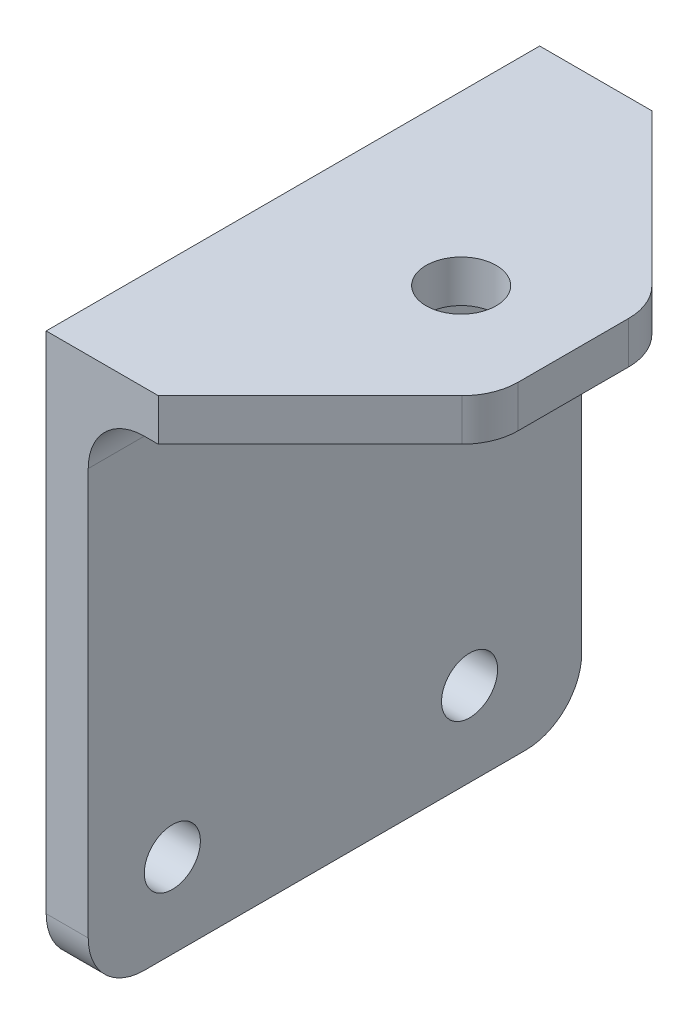
ISO-10303-21;
HEADER;
FILE_DESCRIPTION(('STEP AP214'),'2;1');
FILE_NAME('part.step','',(''),(''),'','','');
FILE_SCHEMA(('AUTOMOTIVE_DESIGN { 1 0 10303 214 1 1 1 1 }'));
ENDSEC;
DATA;
#1=APPLICATION_CONTEXT('core data for automotive mechanical design processes');
#2=APPLICATION_PROTOCOL_DEFINITION('international standard','automotive_design',2000,#1);
#3=PRODUCT_CONTEXT('',#1,'mechanical');
#4=PRODUCT('Part','Part','',(#3));
#5=PRODUCT_RELATED_PRODUCT_CATEGORY('part','',(#4));
#6=PRODUCT_DEFINITION_FORMATION('','',#4);
#7=PRODUCT_DEFINITION_CONTEXT('part definition',#1,'design');
#8=PRODUCT_DEFINITION('design','',#6,#7);
#9=PRODUCT_DEFINITION_SHAPE('','',#8);
#10=(LENGTH_UNIT() NAMED_UNIT(*) SI_UNIT(.MILLI.,.METRE.));
#11=(NAMED_UNIT(*) PLANE_ANGLE_UNIT() SI_UNIT($,.RADIAN.));
#12=(NAMED_UNIT(*) SI_UNIT($,.STERADIAN.) SOLID_ANGLE_UNIT());
#13=UNCERTAINTY_MEASURE_WITH_UNIT(LENGTH_MEASURE(1.E-05),#10,'distance_accuracy_value','');
#14=(GEOMETRIC_REPRESENTATION_CONTEXT(3) GLOBAL_UNCERTAINTY_ASSIGNED_CONTEXT((#13)) GLOBAL_UNIT_ASSIGNED_CONTEXT((#10,
#11,#12)) REPRESENTATION_CONTEXT('',''));
#15=CARTESIAN_POINT('',(0.,0.,0.));
#16=DIRECTION('',(0.,0.,1.));
#17=DIRECTION('',(1.,0.,0.));
#18=AXIS2_PLACEMENT_3D('',#15,#16,#17);
#19=CARTESIAN_POINT('',(0.,-63.5,55.88));
#20=DIRECTION('',(0.,1.,0.));
#21=DIRECTION('',(0.,0.,1.));
#22=AXIS2_PLACEMENT_3D('',#19,#20,#21);
#23=PLANE('',#22);
#24=DIRECTION('',(0.,0.,-1.));
#25=VECTOR('',#24,1.);
#26=CARTESIAN_POINT('',(0.,-63.5,55.88));
#27=LINE('',#26,#25);
#28=CARTESIAN_POINT('',(0.,-63.5,49.53));
#29=VERTEX_POINT('',#28);
#30=CARTESIAN_POINT('',(0.,-63.5,6.35));
#31=VERTEX_POINT('',#30);
#32=EDGE_CURVE('E164',#29,#31,#27,.T.);
#33=ORIENTED_EDGE('',*,*,#32,.T.);
#34=DIRECTION('',(1.,0.,0.));
#35=VECTOR('',#34,1.);
#36=CARTESIAN_POINT('',(4.7625,-63.5,6.35));
#37=LINE('',#36,#35);
#38=CARTESIAN_POINT('',(4.7625,-63.5,6.35));
#39=VERTEX_POINT('',#38);
#40=EDGE_CURVE('E213',#31,#39,#37,.T.);
#41=ORIENTED_EDGE('',*,*,#40,.T.);
#42=DIRECTION('',(0.,0.,-1.));
#43=VECTOR('',#42,1.);
#44=CARTESIAN_POINT('',(4.7625,-63.5,55.88));
#45=LINE('',#44,#43);
#46=CARTESIAN_POINT('',(4.7625,-63.5,49.53));
#47=VERTEX_POINT('',#46);
#48=EDGE_CURVE('E181',#47,#39,#45,.T.);
#49=ORIENTED_EDGE('',*,*,#48,.F.);
#50=DIRECTION('',(1.,0.,0.));
#51=VECTOR('',#50,1.);
#52=CARTESIAN_POINT('',(0.,-63.5,49.53));
#53=LINE('',#52,#51);
#54=EDGE_CURVE('E211',#47,#29,#53,.F.);
#55=ORIENTED_EDGE('',*,*,#54,.T.);
#56=EDGE_LOOP('',(#33,#41,#49,#55));
#57=FACE_BOUND('',#56,.T.);
#58=ADVANCED_FACE('F33',(#57),#23,.F.);
#59=CARTESIAN_POINT('',(4.7625,-63.5,55.88));
#60=DIRECTION('',(-1.,0.,0.));
#61=DIRECTION('',(0.,0.,1.));
#62=AXIS2_PLACEMENT_3D('',#59,#60,#61);
#63=PLANE('',#62);
#64=CARTESIAN_POINT('',(4.7625,-53.975,12.7));
#65=DIRECTION('',(1.,0.,0.));
#66=DIRECTION('',(0.,0.,-1.));
#67=AXIS2_PLACEMENT_3D('',#64,#65,#66);
#68=CIRCLE('',#67,3.175);
#69=CARTESIAN_POINT('',(4.7625,-53.975,9.525));
#70=VERTEX_POINT('',#69);
#71=EDGE_CURVE('E192',#70,#70,#68,.T.);
#72=ORIENTED_EDGE('',*,*,#71,.F.);
#73=EDGE_LOOP('',(#72));
#74=FACE_BOUND('',#73,.T.);
#75=CARTESIAN_POINT('',(4.7625,-53.975,46.355));
#76=DIRECTION('',(1.,0.,0.));
#77=DIRECTION('',(0.,0.,-1.));
#78=AXIS2_PLACEMENT_3D('',#75,#76,#77);
#79=CIRCLE('',#78,3.175);
#80=CARTESIAN_POINT('',(4.7625,-53.975,43.18));
#81=VERTEX_POINT('',#80);
#82=EDGE_CURVE('E188',#81,#81,#79,.T.);
#83=ORIENTED_EDGE('',*,*,#82,.F.);
#84=EDGE_LOOP('',(#83));
#85=FACE_BOUND('',#84,.T.);
#86=ORIENTED_EDGE('',*,*,#48,.T.);
#87=CARTESIAN_POINT('',(4.7625,-57.15,6.35));
#88=DIRECTION('',(-1.,0.,0.));
#89=DIRECTION('',(0.,0.,1.));
#90=AXIS2_PLACEMENT_3D('',#87,#88,#89);
#91=CIRCLE('',#90,6.35);
#92=CARTESIAN_POINT('',(4.7625,-57.15,0.));
#93=VERTEX_POINT('',#92);
#94=EDGE_CURVE('E218',#39,#93,#91,.F.);
#95=ORIENTED_EDGE('',*,*,#94,.T.);
#96=DIRECTION('',(0.,1.,0.));
#97=VECTOR('',#96,1.);
#98=CARTESIAN_POINT('',(4.7625,-63.5,0.));
#99=LINE('',#98,#97);
#100=CARTESIAN_POINT('',(4.7625,-11.1125,0.));
#101=VERTEX_POINT('',#100);
#102=EDGE_CURVE('E232',#93,#101,#99,.T.);
#103=ORIENTED_EDGE('',*,*,#102,.T.);
#104=DIRECTION('',(0.,0.,-1.));
#105=VECTOR('',#104,1.);
#106=CARTESIAN_POINT('',(4.7625,-11.1125,55.88));
#107=LINE('',#106,#105);
#108=CARTESIAN_POINT('',(4.7625,-11.1125,55.88));
#109=VERTEX_POINT('',#108);
#110=EDGE_CURVE('E178',#109,#101,#107,.T.);
#111=ORIENTED_EDGE('',*,*,#110,.F.);
#112=DIRECTION('',(0.,1.,0.));
#113=VECTOR('',#112,1.);
#114=CARTESIAN_POINT('',(4.7625,-63.5,55.88));
#115=LINE('',#114,#113);
#116=CARTESIAN_POINT('',(4.7625,-57.15,55.88));
#117=VERTEX_POINT('',#116);
#118=EDGE_CURVE('E158',#117,#109,#115,.T.);
#119=ORIENTED_EDGE('',*,*,#118,.F.);
#120=CARTESIAN_POINT('',(4.7625,-57.15,49.53));
#121=DIRECTION('',(-1.,0.,0.));
#122=DIRECTION('',(0.,0.,1.));
#123=AXIS2_PLACEMENT_3D('',#120,#121,#122);
#124=CIRCLE('',#123,6.35);
#125=EDGE_CURVE('E216',#117,#47,#124,.F.);
#126=ORIENTED_EDGE('',*,*,#125,.T.);
#127=EDGE_LOOP('',(#86,#95,#103,#111,#119,#126));
#128=FACE_BOUND('',#127,.T.);
#129=ADVANCED_FACE('F230',(#74,#85,#128),#63,.F.);
#130=CARTESIAN_POINT('',(11.1125,-11.1125,55.88));
#131=DIRECTION('',(0.,0.,-1.));
#132=DIRECTION('',(-1.,0.,0.));
#133=AXIS2_PLACEMENT_3D('',#130,#131,#132);
#134=CYLINDRICAL_SURFACE('',#133,6.35);
#135=CARTESIAN_POINT('',(11.1125,-11.1125,0.));
#136=DIRECTION('',(0.,0.,-1.));
#137=DIRECTION('',(-1.,0.,0.));
#138=AXIS2_PLACEMENT_3D('',#135,#136,#137);
#139=CIRCLE('',#138,6.35);
#140=CARTESIAN_POINT('',(11.1125,-4.7625,0.));
#141=VERTEX_POINT('',#140);
#142=EDGE_CURVE('E160',#101,#141,#139,.T.);
#143=ORIENTED_EDGE('',*,*,#142,.T.);
#144=DIRECTION('',(0.,0.,-1.));
#145=VECTOR('',#144,1.);
#146=CARTESIAN_POINT('',(11.1125,-4.7625,55.88));
#147=LINE('',#146,#145);
#148=CARTESIAN_POINT('',(11.1125,-4.7625,55.88));
#149=VERTEX_POINT('',#148);
#150=EDGE_CURVE('E175',#149,#141,#147,.T.);
#151=ORIENTED_EDGE('',*,*,#150,.F.);
#152=CARTESIAN_POINT('',(11.1125,-11.1125,55.88));
#153=DIRECTION('',(0.,0.,-1.));
#154=DIRECTION('',(-1.,0.,0.));
#155=AXIS2_PLACEMENT_3D('',#152,#153,#154);
#156=CIRCLE('',#155,6.35);
#157=EDGE_CURVE('E245',#109,#149,#156,.T.);
#158=ORIENTED_EDGE('',*,*,#157,.F.);
#159=ORIENTED_EDGE('',*,*,#110,.T.);
#160=EDGE_LOOP('',(#143,#151,#158,#159));
#161=FACE_BOUND('',#160,.T.);
#162=ADVANCED_FACE('F285',(#161),#134,.F.);
#163=CARTESIAN_POINT('',(11.1125,-4.7625,55.88));
#164=DIRECTION('',(0.,1.,0.));
#165=DIRECTION('',(0.,0.,1.));
#166=AXIS2_PLACEMENT_3D('',#163,#164,#165);
#167=PLANE('',#166);
#168=CARTESIAN_POINT('',(19.05,-4.7625,27.94));
#169=DIRECTION('',(0.,1.,0.));
#170=DIRECTION('',(0.,0.,1.));
#171=AXIS2_PLACEMENT_3D('',#168,#169,#170);
#172=CIRCLE('',#171,3.96875);
#173=CARTESIAN_POINT('',(19.05,-4.7625,31.90875));
#174=VERTEX_POINT('',#173);
#175=EDGE_CURVE('E234',#174,#174,#172,.T.);
#176=ORIENTED_EDGE('',*,*,#175,.T.);
#177=EDGE_LOOP('',(#176));
#178=FACE_BOUND('',#177,.T.);
#179=DIRECTION('',(0.,0.,-1.));
#180=VECTOR('',#179,1.);
#181=CARTESIAN_POINT('',(31.75,-4.7625,55.88));
#182=LINE('',#181,#180);
#183=CARTESIAN_POINT('',(31.75,-4.7625,34.1997438789308));
#184=VERTEX_POINT('',#183);
#185=CARTESIAN_POINT('',(31.75,-4.7625,21.6802561210692));
#186=VERTEX_POINT('',#185);
#187=EDGE_CURVE('E172',#184,#186,#182,.T.);
#188=ORIENTED_EDGE('',*,*,#187,.F.);
#189=CARTESIAN_POINT('',(25.4,-4.7625,34.1997438789308));
#190=DIRECTION('',(0.,1.,0.));
#191=DIRECTION('',(0.,0.,1.));
#192=AXIS2_PLACEMENT_3D('',#189,#190,#191);
#193=CIRCLE('',#192,6.35);
#194=CARTESIAN_POINT('',(29.8901280605345,-4.7625,38.6898719394654));
#195=VERTEX_POINT('',#194);
#196=EDGE_CURVE('E207',#184,#195,#193,.F.);
#197=ORIENTED_EDGE('',*,*,#196,.T.);
#198=DIRECTION('',(-0.707106781186551,0.,0.707106781186544));
#199=VECTOR('',#198,1.);
#200=CARTESIAN_POINT('',(11.9062499999999,-4.7625,56.6737499999999));
#201=LINE('',#200,#199);
#202=CARTESIAN_POINT('',(12.6999999999998,-4.7625,55.88));
#203=VERTEX_POINT('',#202);
#204=EDGE_CURVE('E254',#195,#203,#201,.T.);
#205=ORIENTED_EDGE('',*,*,#204,.T.);
#206=DIRECTION('',(1.,0.,0.));
#207=VECTOR('',#206,1.);
#208=CARTESIAN_POINT('',(11.1125,-4.7625,55.88));
#209=LINE('',#208,#207);
#210=EDGE_CURVE('E242',#149,#203,#209,.T.);
#211=ORIENTED_EDGE('',*,*,#210,.F.);
#212=ORIENTED_EDGE('',*,*,#150,.T.);
#213=DIRECTION('',(1.,0.,0.));
#214=VECTOR('',#213,1.);
#215=CARTESIAN_POINT('',(11.1125,-4.7625,0.));
#216=LINE('',#215,#214);
#217=CARTESIAN_POINT('',(12.6999999999998,-4.7625,0.));
#218=VERTEX_POINT('',#217);
#219=EDGE_CURVE('E156',#141,#218,#216,.T.);
#220=ORIENTED_EDGE('',*,*,#219,.T.);
#221=DIRECTION('',(0.707106781186552,0.,0.707106781186544));
#222=VECTOR('',#221,1.);
#223=CARTESIAN_POINT('',(39.8462499999999,-4.7625,27.1462499999998));
#224=LINE('',#223,#222);
#225=CARTESIAN_POINT('',(29.8901280605345,-4.7625,17.1901280605346));
#226=VERTEX_POINT('',#225);
#227=EDGE_CURVE('E138',#218,#226,#224,.T.);
#228=ORIENTED_EDGE('',*,*,#227,.T.);
#229=CARTESIAN_POINT('',(25.4,-4.7625,21.6802561210692));
#230=DIRECTION('',(0.,1.,0.));
#231=DIRECTION('',(0.,0.,1.));
#232=AXIS2_PLACEMENT_3D('',#229,#230,#231);
#233=CIRCLE('',#232,6.35);
#234=EDGE_CURVE('E205',#226,#186,#233,.F.);
#235=ORIENTED_EDGE('',*,*,#234,.T.);
#236=EDGE_LOOP('',(#188,#197,#205,#211,#212,#220,#228,#235));
#237=FACE_BOUND('',#236,.T.);
#238=ADVANCED_FACE('F261',(#178,#237),#167,.F.);
#239=CARTESIAN_POINT('',(31.75,-4.7625,55.88));
#240=DIRECTION('',(-1.,0.,0.));
#241=DIRECTION('',(0.,0.,1.));
#242=AXIS2_PLACEMENT_3D('',#239,#240,#241);
#243=PLANE('',#242);
#244=DIRECTION('',(0.,0.,-1.));
#245=VECTOR('',#244,1.);
#246=CARTESIAN_POINT('',(31.75,0.,55.88));
#247=LINE('',#246,#245);
#248=CARTESIAN_POINT('',(31.75,0.,34.1997438789308));
#249=VERTEX_POINT('',#248);
#250=CARTESIAN_POINT('',(31.75,0.,21.6802561210692));
#251=VERTEX_POINT('',#250);
#252=EDGE_CURVE('E170',#249,#251,#247,.T.);
#253=ORIENTED_EDGE('',*,*,#252,.F.);
#254=DIRECTION('',(0.,1.,0.));
#255=VECTOR('',#254,1.);
#256=CARTESIAN_POINT('',(31.75,-4.7625,34.1997438789308));
#257=LINE('',#256,#255);
#258=EDGE_CURVE('E203',#249,#184,#257,.F.);
#259=ORIENTED_EDGE('',*,*,#258,.T.);
#260=ORIENTED_EDGE('',*,*,#187,.T.);
#261=DIRECTION('',(0.,1.,0.));
#262=VECTOR('',#261,1.);
#263=CARTESIAN_POINT('',(31.75,-4.7625,21.6802561210692));
#264=LINE('',#263,#262);
#265=EDGE_CURVE('E200',#186,#251,#264,.T.);
#266=ORIENTED_EDGE('',*,*,#265,.T.);
#267=EDGE_LOOP('',(#253,#259,#260,#266));
#268=FACE_BOUND('',#267,.T.);
#269=ADVANCED_FACE('F267',(#268),#243,.F.);
#270=CARTESIAN_POINT('',(0.,0.,55.88));
#271=DIRECTION('',(0.,-1.,0.));
#272=DIRECTION('',(0.,0.,-1.));
#273=AXIS2_PLACEMENT_3D('',#270,#271,#272);
#274=PLANE('',#273);
#275=CARTESIAN_POINT('',(19.05,0.,27.94));
#276=DIRECTION('',(0.,1.,0.));
#277=DIRECTION('',(0.,0.,1.));
#278=AXIS2_PLACEMENT_3D('',#275,#276,#277);
#279=CIRCLE('',#278,3.96875);
#280=CARTESIAN_POINT('',(19.05,0.,31.90875));
#281=VERTEX_POINT('',#280);
#282=EDGE_CURVE('E187',#281,#281,#279,.T.);
#283=ORIENTED_EDGE('',*,*,#282,.F.);
#284=EDGE_LOOP('',(#283));
#285=FACE_BOUND('',#284,.T.);
#286=DIRECTION('',(-0.707106781186551,0.,0.707106781186544));
#287=VECTOR('',#286,1.);
#288=CARTESIAN_POINT('',(12.6999999999998,0.,55.88));
#289=LINE('',#288,#287);
#290=CARTESIAN_POINT('',(29.8901280605345,0.,38.6898719394654));
#291=VERTEX_POINT('',#290);
#292=CARTESIAN_POINT('',(12.6999999999998,0.,55.88));
#293=VERTEX_POINT('',#292);
#294=EDGE_CURVE('E256',#291,#293,#289,.T.);
#295=ORIENTED_EDGE('',*,*,#294,.F.);
#296=CARTESIAN_POINT('',(25.4,0.,34.1997438789308));
#297=DIRECTION('',(0.,-1.,0.));
#298=DIRECTION('',(0.,0.,-1.));
#299=AXIS2_PLACEMENT_3D('',#296,#297,#298);
#300=CIRCLE('',#299,6.35);
#301=EDGE_CURVE('E198',#291,#249,#300,.F.);
#302=ORIENTED_EDGE('',*,*,#301,.T.);
#303=ORIENTED_EDGE('',*,*,#252,.T.);
#304=CARTESIAN_POINT('',(25.4,0.,21.6802561210692));
#305=DIRECTION('',(0.,-1.,0.));
#306=DIRECTION('',(0.,0.,-1.));
#307=AXIS2_PLACEMENT_3D('',#304,#305,#306);
#308=CIRCLE('',#307,6.35);
#309=CARTESIAN_POINT('',(29.8901280605345,0.,17.1901280605346));
#310=VERTEX_POINT('',#309);
#311=EDGE_CURVE('E152',#251,#310,#308,.F.);
#312=ORIENTED_EDGE('',*,*,#311,.T.);
#313=DIRECTION('',(0.707106781186552,0.,0.707106781186544));
#314=VECTOR('',#313,1.);
#315=CARTESIAN_POINT('',(12.6999999999998,0.,0.));
#316=LINE('',#315,#314);
#317=CARTESIAN_POINT('',(12.6999999999998,0.,0.));
#318=VERTEX_POINT('',#317);
#319=EDGE_CURVE('E135',#318,#310,#316,.T.);
#320=ORIENTED_EDGE('',*,*,#319,.F.);
#321=DIRECTION('',(-1.,0.,0.));
#322=VECTOR('',#321,1.);
#323=CARTESIAN_POINT('',(0.,0.,0.));
#324=LINE('',#323,#322);
#325=CARTESIAN_POINT('',(0.,0.,0.));
#326=VERTEX_POINT('',#325);
#327=EDGE_CURVE('E149',#318,#326,#324,.T.);
#328=ORIENTED_EDGE('',*,*,#327,.T.);
#329=DIRECTION('',(0.,0.,-1.));
#330=VECTOR('',#329,1.);
#331=CARTESIAN_POINT('',(0.,0.,55.88));
#332=LINE('',#331,#330);
#333=CARTESIAN_POINT('',(0.,0.,55.88));
#334=VERTEX_POINT('',#333);
#335=EDGE_CURVE('E167',#334,#326,#332,.T.);
#336=ORIENTED_EDGE('',*,*,#335,.F.);
#337=DIRECTION('',(-1.,0.,0.));
#338=VECTOR('',#337,1.);
#339=CARTESIAN_POINT('',(0.,0.,55.88));
#340=LINE('',#339,#338);
#341=EDGE_CURVE('E240',#293,#334,#340,.T.);
#342=ORIENTED_EDGE('',*,*,#341,.F.);
#343=EDGE_LOOP('',(#295,#302,#303,#312,#320,#328,#336,#342));
#344=FACE_BOUND('',#343,.T.);
#345=ADVANCED_FACE('F147',(#285,#344),#274,.F.);
#346=CARTESIAN_POINT('',(0.,-63.5,55.88));
#347=DIRECTION('',(1.,0.,0.));
#348=DIRECTION('',(0.,0.,-1.));
#349=AXIS2_PLACEMENT_3D('',#346,#347,#348);
#350=PLANE('',#349);
#351=CARTESIAN_POINT('',(0.,-53.975,12.7));
#352=DIRECTION('',(1.,0.,0.));
#353=DIRECTION('',(0.,0.,-1.));
#354=AXIS2_PLACEMENT_3D('',#351,#352,#353);
#355=CIRCLE('',#354,3.175);
#356=CARTESIAN_POINT('',(0.,-53.975,9.525));
#357=VERTEX_POINT('',#356);
#358=EDGE_CURVE('E189',#357,#357,#355,.T.);
#359=ORIENTED_EDGE('',*,*,#358,.T.);
#360=EDGE_LOOP('',(#359));
#361=FACE_BOUND('',#360,.T.);
#362=CARTESIAN_POINT('',(0.,-53.975,46.355));
#363=DIRECTION('',(1.,0.,0.));
#364=DIRECTION('',(0.,0.,-1.));
#365=AXIS2_PLACEMENT_3D('',#362,#363,#364);
#366=CIRCLE('',#365,3.175);
#367=CARTESIAN_POINT('',(0.,-53.975,43.18));
#368=VERTEX_POINT('',#367);
#369=EDGE_CURVE('E184',#368,#368,#366,.T.);
#370=ORIENTED_EDGE('',*,*,#369,.T.);
#371=EDGE_LOOP('',(#370));
#372=FACE_BOUND('',#371,.T.);
#373=DIRECTION('',(0.,-1.,0.));
#374=VECTOR('',#373,1.);
#375=CARTESIAN_POINT('',(0.,-63.5,0.));
#376=LINE('',#375,#374);
#377=CARTESIAN_POINT('',(0.,-57.15,0.));
#378=VERTEX_POINT('',#377);
#379=EDGE_CURVE('E155',#326,#378,#376,.T.);
#380=ORIENTED_EDGE('',*,*,#379,.T.);
#381=CARTESIAN_POINT('',(0.,-57.15,6.35));
#382=DIRECTION('',(1.,0.,0.));
#383=DIRECTION('',(0.,0.,-1.));
#384=AXIS2_PLACEMENT_3D('',#381,#382,#383);
#385=CIRCLE('',#384,6.35);
#386=EDGE_CURVE('E41',#378,#31,#385,.F.);
#387=ORIENTED_EDGE('',*,*,#386,.T.);
#388=ORIENTED_EDGE('',*,*,#32,.F.);
#389=CARTESIAN_POINT('',(0.,-57.15,49.53));
#390=DIRECTION('',(1.,0.,0.));
#391=DIRECTION('',(0.,0.,-1.));
#392=AXIS2_PLACEMENT_3D('',#389,#390,#391);
#393=CIRCLE('',#392,6.35);
#394=CARTESIAN_POINT('',(0.,-57.15,55.88));
#395=VERTEX_POINT('',#394);
#396=EDGE_CURVE('E48',#29,#395,#393,.F.);
#397=ORIENTED_EDGE('',*,*,#396,.T.);
#398=DIRECTION('',(0.,-1.,0.));
#399=VECTOR('',#398,1.);
#400=CARTESIAN_POINT('',(0.,-63.5,55.88));
#401=LINE('',#400,#399);
#402=EDGE_CURVE('E168',#334,#395,#401,.T.);
#403=ORIENTED_EDGE('',*,*,#402,.F.);
#404=ORIENTED_EDGE('',*,*,#335,.T.);
#405=EDGE_LOOP('',(#380,#387,#388,#397,#403,#404));
#406=FACE_BOUND('',#405,.T.);
#407=ADVANCED_FACE('F222',(#361,#372,#406),#350,.F.);
#408=CARTESIAN_POINT('',(11.1125,-11.1125,55.88));
#409=DIRECTION('',(0.,0.,-1.));
#410=DIRECTION('',(-1.,0.,0.));
#411=AXIS2_PLACEMENT_3D('',#408,#409,#410);
#412=PLANE('',#411);
#413=ORIENTED_EDGE('',*,*,#402,.T.);
#414=DIRECTION('',(1.,0.,0.));
#415=VECTOR('',#414,1.);
#416=CARTESIAN_POINT('',(11.1125,-57.15,55.88));
#417=LINE('',#416,#415);
#418=EDGE_CURVE('E11',#395,#117,#417,.T.);
#419=ORIENTED_EDGE('',*,*,#418,.T.);
#420=ORIENTED_EDGE('',*,*,#118,.T.);
#421=ORIENTED_EDGE('',*,*,#157,.T.);
#422=ORIENTED_EDGE('',*,*,#210,.T.);
#423=DIRECTION('',(0.,1.,0.));
#424=VECTOR('',#423,1.);
#425=CARTESIAN_POINT('',(12.6999999999998,-11.1125,55.88));
#426=LINE('',#425,#424);
#427=EDGE_CURVE('E143',#203,#293,#426,.T.);
#428=ORIENTED_EDGE('',*,*,#427,.T.);
#429=ORIENTED_EDGE('',*,*,#341,.T.);
#430=EDGE_LOOP('',(#413,#419,#420,#421,#422,#428,#429));
#431=FACE_BOUND('',#430,.T.);
#432=ADVANCED_FACE('F281',(#431),#412,.F.);
#433=CARTESIAN_POINT('',(11.1125,-11.1125,0.));
#434=DIRECTION('',(0.,0.,-1.));
#435=DIRECTION('',(-1.,0.,0.));
#436=AXIS2_PLACEMENT_3D('',#433,#434,#435);
#437=PLANE('',#436);
#438=ORIENTED_EDGE('',*,*,#102,.F.);
#439=DIRECTION('',(1.,0.,0.));
#440=VECTOR('',#439,1.);
#441=CARTESIAN_POINT('',(0.,-57.15,0.));
#442=LINE('',#441,#440);
#443=EDGE_CURVE('E56',#93,#378,#442,.F.);
#444=ORIENTED_EDGE('',*,*,#443,.T.);
#445=ORIENTED_EDGE('',*,*,#379,.F.);
#446=ORIENTED_EDGE('',*,*,#327,.F.);
#447=DIRECTION('',(0.,1.,0.));
#448=VECTOR('',#447,1.);
#449=CARTESIAN_POINT('',(12.6999999999998,-11.1125,0.));
#450=LINE('',#449,#448);
#451=EDGE_CURVE('E132',#218,#318,#450,.T.);
#452=ORIENTED_EDGE('',*,*,#451,.F.);
#453=ORIENTED_EDGE('',*,*,#219,.F.);
#454=ORIENTED_EDGE('',*,*,#142,.F.);
#455=EDGE_LOOP('',(#438,#444,#445,#446,#452,#453,#454));
#456=FACE_BOUND('',#455,.T.);
#457=ADVANCED_FACE('F154',(#456),#437,.T.);
#458=CARTESIAN_POINT('',(19.05,-31.75,27.94));
#459=DIRECTION('',(0.,1.,0.));
#460=DIRECTION('',(0.,0.,1.));
#461=AXIS2_PLACEMENT_3D('',#458,#459,#460);
#462=CYLINDRICAL_SURFACE('',#461,3.96875);
#463=ORIENTED_EDGE('',*,*,#282,.T.);
#464=EDGE_LOOP('',(#463));
#465=FACE_BOUND('',#464,.T.);
#466=ORIENTED_EDGE('',*,*,#175,.F.);
#467=EDGE_LOOP('',(#466));
#468=FACE_BOUND('',#467,.T.);
#469=ADVANCED_FACE('F357',(#465,#468),#462,.F.);
#470=CARTESIAN_POINT('',(-26.9875,-53.975,46.355));
#471=DIRECTION('',(1.,0.,0.));
#472=DIRECTION('',(0.,0.,-1.));
#473=AXIS2_PLACEMENT_3D('',#470,#471,#472);
#474=CYLINDRICAL_SURFACE('',#473,3.175);
#475=ORIENTED_EDGE('',*,*,#82,.T.);
#476=EDGE_LOOP('',(#475));
#477=FACE_BOUND('',#476,.T.);
#478=ORIENTED_EDGE('',*,*,#369,.F.);
#479=EDGE_LOOP('',(#478));
#480=FACE_BOUND('',#479,.T.);
#481=ADVANCED_FACE('F348',(#477,#480),#474,.F.);
#482=CARTESIAN_POINT('',(-26.9875,-53.975,12.7));
#483=DIRECTION('',(1.,0.,0.));
#484=DIRECTION('',(0.,0.,-1.));
#485=AXIS2_PLACEMENT_3D('',#482,#483,#484);
#486=CYLINDRICAL_SURFACE('',#485,3.175);
#487=ORIENTED_EDGE('',*,*,#71,.T.);
#488=EDGE_LOOP('',(#487));
#489=FACE_BOUND('',#488,.T.);
#490=ORIENTED_EDGE('',*,*,#358,.F.);
#491=EDGE_LOOP('',(#490));
#492=FACE_BOUND('',#491,.T.);
#493=ADVANCED_FACE('F339',(#489,#492),#486,.F.);
#494=CARTESIAN_POINT('',(12.6999999999998,-63.5,55.88));
#495=DIRECTION('',(-0.707106781186544,0.,-0.707106781186551));
#496=DIRECTION('',(-0.707106781186551,0.,0.707106781186544));
#497=AXIS2_PLACEMENT_3D('',#494,#495,#496);
#498=PLANE('',#497);
#499=ORIENTED_EDGE('',*,*,#204,.F.);
#500=DIRECTION('',(0.,1.,0.));
#501=VECTOR('',#500,1.);
#502=CARTESIAN_POINT('',(29.8901280605345,-63.5,38.6898719394654));
#503=LINE('',#502,#501);
#504=EDGE_CURVE('E142',#195,#291,#503,.T.);
#505=ORIENTED_EDGE('',*,*,#504,.T.);
#506=ORIENTED_EDGE('',*,*,#294,.T.);
#507=ORIENTED_EDGE('',*,*,#427,.F.);
#508=EDGE_LOOP('',(#499,#505,#506,#507));
#509=FACE_BOUND('',#508,.T.);
#510=ADVANCED_FACE('F276',(#509),#498,.F.);
#511=CARTESIAN_POINT('',(12.6999999999998,-63.5,0.));
#512=DIRECTION('',(-0.707106781186543,0.,0.707106781186551));
#513=DIRECTION('',(0.707106781186552,0.,0.707106781186544));
#514=AXIS2_PLACEMENT_3D('',#511,#512,#513);
#515=PLANE('',#514);
#516=ORIENTED_EDGE('',*,*,#319,.T.);
#517=DIRECTION('',(0.,1.,0.));
#518=VECTOR('',#517,1.);
#519=CARTESIAN_POINT('',(29.8901280605345,-63.5,17.1901280605346));
#520=LINE('',#519,#518);
#521=EDGE_CURVE('E209',#310,#226,#520,.F.);
#522=ORIENTED_EDGE('',*,*,#521,.T.);
#523=ORIENTED_EDGE('',*,*,#227,.F.);
#524=ORIENTED_EDGE('',*,*,#451,.T.);
#525=EDGE_LOOP('',(#516,#522,#523,#524));
#526=FACE_BOUND('',#525,.T.);
#527=ADVANCED_FACE('F134',(#526),#515,.F.);
#528=CARTESIAN_POINT('',(25.4,-63.5,34.1997438789308));
#529=DIRECTION('',(0.,1.,0.));
#530=DIRECTION('',(0.,0.,1.));
#531=AXIS2_PLACEMENT_3D('',#528,#529,#530);
#532=CYLINDRICAL_SURFACE('',#531,6.35);
#533=ORIENTED_EDGE('',*,*,#196,.F.);
#534=ORIENTED_EDGE('',*,*,#258,.F.);
#535=ORIENTED_EDGE('',*,*,#301,.F.);
#536=ORIENTED_EDGE('',*,*,#504,.F.);
#537=EDGE_LOOP('',(#533,#534,#535,#536));
#538=FACE_BOUND('',#537,.T.);
#539=ADVANCED_FACE('F273',(#538),#532,.T.);
#540=CARTESIAN_POINT('',(25.4,-4.7625,21.6802561210692));
#541=DIRECTION('',(0.,1.,0.));
#542=DIRECTION('',(0.,0.,1.));
#543=AXIS2_PLACEMENT_3D('',#540,#541,#542);
#544=CYLINDRICAL_SURFACE('',#543,6.35);
#545=ORIENTED_EDGE('',*,*,#234,.F.);
#546=ORIENTED_EDGE('',*,*,#521,.F.);
#547=ORIENTED_EDGE('',*,*,#311,.F.);
#548=ORIENTED_EDGE('',*,*,#265,.F.);
#549=EDGE_LOOP('',(#545,#546,#547,#548));
#550=FACE_BOUND('',#549,.T.);
#551=ADVANCED_FACE('F264',(#550),#544,.T.);
#552=CARTESIAN_POINT('',(0.,-57.15,6.35));
#553=DIRECTION('',(-1.,0.,0.));
#554=DIRECTION('',(0.,0.,1.));
#555=AXIS2_PLACEMENT_3D('',#552,#553,#554);
#556=CYLINDRICAL_SURFACE('',#555,6.35);
#557=ORIENTED_EDGE('',*,*,#386,.F.);
#558=ORIENTED_EDGE('',*,*,#443,.F.);
#559=ORIENTED_EDGE('',*,*,#94,.F.);
#560=ORIENTED_EDGE('',*,*,#40,.F.);
#561=EDGE_LOOP('',(#557,#558,#559,#560));
#562=FACE_BOUND('',#561,.T.);
#563=ADVANCED_FACE('F228',(#562),#556,.T.);
#564=CARTESIAN_POINT('',(11.1125,-57.15,49.53));
#565=DIRECTION('',(1.,0.,0.));
#566=DIRECTION('',(0.,0.,-1.));
#567=AXIS2_PLACEMENT_3D('',#564,#565,#566);
#568=CYLINDRICAL_SURFACE('',#567,6.35);
#569=ORIENTED_EDGE('',*,*,#396,.F.);
#570=ORIENTED_EDGE('',*,*,#54,.F.);
#571=ORIENTED_EDGE('',*,*,#125,.F.);
#572=ORIENTED_EDGE('',*,*,#418,.F.);
#573=EDGE_LOOP('',(#569,#570,#571,#572));
#574=FACE_BOUND('',#573,.T.);
#575=ADVANCED_FACE('F35',(#574),#568,.T.);
#576=CLOSED_SHELL('',(#58,#129,#162,#238,#269,#345,#407,#432,#457,#469,#481,#493,#510,#527,#539,
#551,#563,#575));
#577=MANIFOLD_SOLID_BREP('B2',#576);
#578=ADVANCED_BREP_SHAPE_REPRESENTATION('',(#18,#577),#14);
#579=SHAPE_DEFINITION_REPRESENTATION(#9,#578);
ENDSEC;
END-ISO-10303-21;
